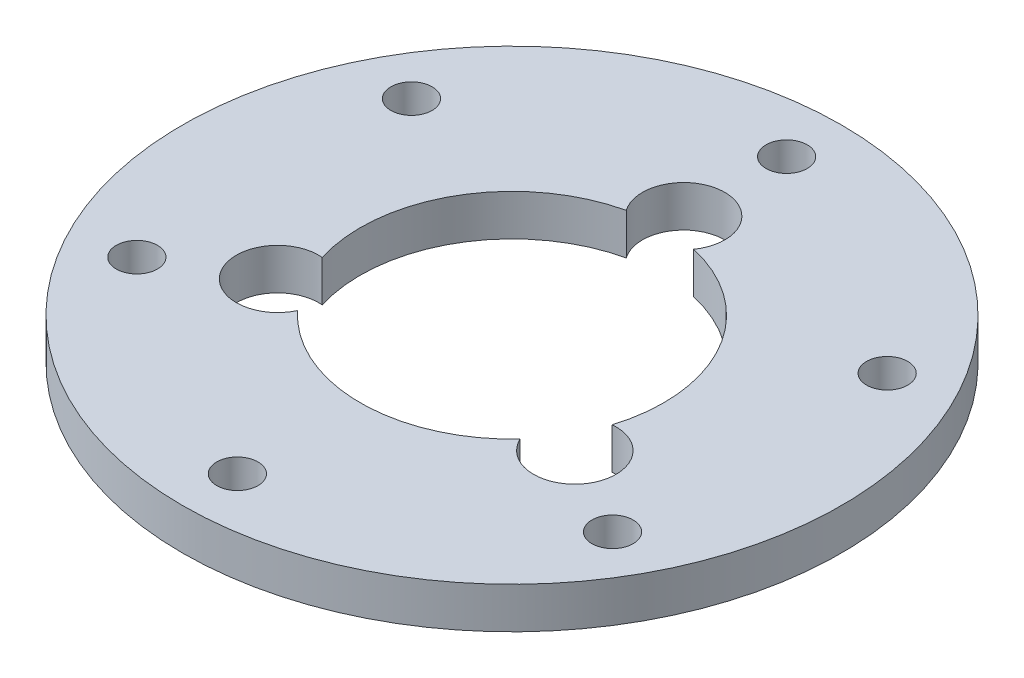
ISO-10303-21;
HEADER;
FILE_DESCRIPTION(('STEP AP214'),'2;1');
FILE_NAME('part.step','',(''),(''),'','','');
FILE_SCHEMA(('AUTOMOTIVE_DESIGN { 1 0 10303 214 1 1 1 1 }'));
ENDSEC;
DATA;
#1=APPLICATION_CONTEXT('core data for automotive mechanical design processes');
#2=APPLICATION_PROTOCOL_DEFINITION('international standard','automotive_design',2000,#1);
#3=PRODUCT_CONTEXT('',#1,'mechanical');
#4=PRODUCT('Part','Part','',(#3));
#5=PRODUCT_RELATED_PRODUCT_CATEGORY('part','',(#4));
#6=PRODUCT_DEFINITION_FORMATION('','',#4);
#7=PRODUCT_DEFINITION_CONTEXT('part definition',#1,'design');
#8=PRODUCT_DEFINITION('design','',#6,#7);
#9=PRODUCT_DEFINITION_SHAPE('','',#8);
#10=(LENGTH_UNIT() NAMED_UNIT(*) SI_UNIT(.MILLI.,.METRE.));
#11=(NAMED_UNIT(*) PLANE_ANGLE_UNIT() SI_UNIT($,.RADIAN.));
#12=(NAMED_UNIT(*) SI_UNIT($,.STERADIAN.) SOLID_ANGLE_UNIT());
#13=UNCERTAINTY_MEASURE_WITH_UNIT(LENGTH_MEASURE(1.E-05),#10,'distance_accuracy_value','');
#14=(GEOMETRIC_REPRESENTATION_CONTEXT(3) GLOBAL_UNCERTAINTY_ASSIGNED_CONTEXT((#13)) GLOBAL_UNIT_ASSIGNED_CONTEXT((#10,
#11,#12)) REPRESENTATION_CONTEXT('',''));
#15=CARTESIAN_POINT('',(0.,0.,0.));
#16=DIRECTION('',(0.,0.,1.));
#17=DIRECTION('',(1.,0.,0.));
#18=AXIS2_PLACEMENT_3D('',#15,#16,#17);
#19=CARTESIAN_POINT('',(0.,3.,0.));
#20=DIRECTION('',(0.,-1.,0.));
#21=DIRECTION('',(0.,0.,-1.));
#22=AXIS2_PLACEMENT_3D('',#19,#20,#21);
#23=CYLINDRICAL_SURFACE('',#22,11.05);
#24=DIRECTION('',(0.,-1.,0.));
#25=VECTOR('',#24,1.);
#26=CARTESIAN_POINT('',(8.10373057428424,5.,7.51212691449039));
#27=LINE('',#26,#25);
#28=CARTESIAN_POINT('',(8.10373057428424,0.,7.51212691449039));
#29=VERTEX_POINT('',#28);
#30=CARTESIAN_POINT('',(8.10373057428424,3.,7.51212691449039));
#31=VERTEX_POINT('',#30);
#32=EDGE_CURVE('E11',#29,#31,#27,.F.);
#33=ORIENTED_EDGE('',*,*,#32,.F.);
#34=CARTESIAN_POINT('',(0.,0.,0.));
#35=DIRECTION('',(0.,1.,0.));
#36=DIRECTION('',(0.,0.,1.));
#37=AXIS2_PLACEMENT_3D('',#34,#35,#36);
#38=CIRCLE('',#37,11.05);
#39=CARTESIAN_POINT('',(-8.10373057428423,0.,7.5121269144904));
#40=VERTEX_POINT('',#39);
#41=EDGE_CURVE('E111',#40,#29,#38,.T.);
#42=ORIENTED_EDGE('',*,*,#41,.F.);
#43=DIRECTION('',(0.,-1.,0.));
#44=VECTOR('',#43,1.);
#45=CARTESIAN_POINT('',(-8.10373057428423,5.,7.51212691449039));
#46=LINE('',#45,#44);
#47=CARTESIAN_POINT('',(-8.10373057428423,3.,7.5121269144904));
#48=VERTEX_POINT('',#47);
#49=EDGE_CURVE('E90',#48,#40,#46,.T.);
#50=ORIENTED_EDGE('',*,*,#49,.F.);
#51=CARTESIAN_POINT('',(0.,3.,0.));
#52=DIRECTION('',(0.,1.,0.));
#53=DIRECTION('',(0.,0.,1.));
#54=AXIS2_PLACEMENT_3D('',#51,#52,#53);
#55=CIRCLE('',#54,11.05);
#56=EDGE_CURVE('E113',#48,#31,#55,.T.);
#57=ORIENTED_EDGE('',*,*,#56,.T.);
#58=EDGE_LOOP('',(#33,#42,#50,#57));
#59=FACE_BOUND('',#58,.T.);
#60=ADVANCED_FACE('F36',(#59),#23,.F.);
#61=DIRECTION('',(0.,-1.,0.));
#62=VECTOR('',#61,1.);
#63=CARTESIAN_POINT('',(-10.5575580315436,5.,3.26197308550961));
#64=LINE('',#63,#62);
#65=CARTESIAN_POINT('',(-10.5575580315436,0.,3.26197308550961));
#66=VERTEX_POINT('',#65);
#67=CARTESIAN_POINT('',(-10.5575580315436,3.,3.26197308550962));
#68=VERTEX_POINT('',#67);
#69=EDGE_CURVE('E89',#66,#68,#64,.F.);
#70=ORIENTED_EDGE('',*,*,#69,.F.);
#71=CARTESIAN_POINT('',(-2.45382745725937,0.,-10.7741));
#72=VERTEX_POINT('',#71);
#73=EDGE_CURVE('E102',#72,#66,#38,.T.);
#74=ORIENTED_EDGE('',*,*,#73,.F.);
#75=DIRECTION('',(0.,-1.,0.));
#76=VECTOR('',#75,1.);
#77=CARTESIAN_POINT('',(-2.45382745725937,5.,-10.7741));
#78=LINE('',#77,#76);
#79=CARTESIAN_POINT('',(-2.45382745725938,3.,-10.7741));
#80=VERTEX_POINT('',#79);
#81=EDGE_CURVE('E121',#80,#72,#78,.T.);
#82=ORIENTED_EDGE('',*,*,#81,.F.);
#83=EDGE_CURVE('E104',#80,#68,#55,.T.);
#84=ORIENTED_EDGE('',*,*,#83,.T.);
#85=EDGE_LOOP('',(#70,#74,#82,#84));
#86=FACE_BOUND('',#85,.T.);
#87=ADVANCED_FACE('F101',(#86),#23,.F.);
#88=CARTESIAN_POINT('',(0.,3.,0.));
#89=DIRECTION('',(0.,1.,0.));
#90=DIRECTION('',(0.,0.,1.));
#91=AXIS2_PLACEMENT_3D('',#88,#89,#90);
#92=PLANE('',#91);
#93=CARTESIAN_POINT('',(10.8253175473055,3.,6.25));
#94=DIRECTION('',(0.,1.,0.));
#95=DIRECTION('',(0.,0.,1.));
#96=AXIS2_PLACEMENT_3D('',#93,#94,#95);
#97=CIRCLE('',#96,3.);
#98=CARTESIAN_POINT('',(10.5575580315436,3.,3.26197308550961));
#99=VERTEX_POINT('',#98);
#100=EDGE_CURVE('E135',#31,#99,#97,.T.);
#101=ORIENTED_EDGE('',*,*,#100,.F.);
#102=ORIENTED_EDGE('',*,*,#56,.F.);
#103=CARTESIAN_POINT('',(-10.8253175473055,3.,6.25000000000001));
#104=DIRECTION('',(0.,1.,0.));
#105=DIRECTION('',(0.,0.,1.));
#106=AXIS2_PLACEMENT_3D('',#103,#104,#105);
#107=CIRCLE('',#106,3.);
#108=EDGE_CURVE('E51',#68,#48,#107,.T.);
#109=ORIENTED_EDGE('',*,*,#108,.F.);
#110=ORIENTED_EDGE('',*,*,#83,.F.);
#111=CARTESIAN_POINT('',(0.,3.,-12.5));
#112=DIRECTION('',(0.,1.,0.));
#113=DIRECTION('',(0.,0.,1.));
#114=AXIS2_PLACEMENT_3D('',#111,#112,#113);
#115=CIRCLE('',#114,3.);
#116=CARTESIAN_POINT('',(2.45382745725937,3.,-10.7741));
#117=VERTEX_POINT('',#116);
#118=EDGE_CURVE('E59',#117,#80,#115,.T.);
#119=ORIENTED_EDGE('',*,*,#118,.F.);
#120=EDGE_CURVE('E125',#99,#117,#55,.T.);
#121=ORIENTED_EDGE('',*,*,#120,.F.);
#122=EDGE_LOOP('',(#101,#102,#109,#110,#119,#121));
#123=FACE_BOUND('',#122,.T.);
#124=CARTESIAN_POINT('',(-17.3205080756888,3.,10.));
#125=DIRECTION('',(0.,1.,0.));
#126=DIRECTION('',(0.,0.,1.));
#127=AXIS2_PLACEMENT_3D('',#124,#125,#126);
#128=CIRCLE('',#127,1.5);
#129=CARTESIAN_POINT('',(-17.3205080756888,3.,11.5));
#130=VERTEX_POINT('',#129);
#131=EDGE_CURVE('E159',#130,#130,#128,.T.);
#132=ORIENTED_EDGE('',*,*,#131,.F.);
#133=EDGE_LOOP('',(#132));
#134=FACE_BOUND('',#133,.T.);
#135=CARTESIAN_POINT('',(17.3205080756888,3.,10.));
#136=DIRECTION('',(0.,1.,0.));
#137=DIRECTION('',(0.,0.,1.));
#138=AXIS2_PLACEMENT_3D('',#135,#136,#137);
#139=CIRCLE('',#138,1.5);
#140=CARTESIAN_POINT('',(17.3205080756888,3.,11.5));
#141=VERTEX_POINT('',#140);
#142=EDGE_CURVE('E171',#141,#141,#139,.T.);
#143=ORIENTED_EDGE('',*,*,#142,.F.);
#144=EDGE_LOOP('',(#143));
#145=FACE_BOUND('',#144,.T.);
#146=CARTESIAN_POINT('',(0.,3.,0.));
#147=DIRECTION('',(0.,1.,0.));
#148=DIRECTION('',(0.,0.,1.));
#149=AXIS2_PLACEMENT_3D('',#146,#147,#148);
#150=CIRCLE('',#149,24.);
#151=CARTESIAN_POINT('',(0.,3.,24.));
#152=VERTEX_POINT('',#151);
#153=EDGE_CURVE('E118',#152,#152,#150,.T.);
#154=ORIENTED_EDGE('',*,*,#153,.T.);
#155=EDGE_LOOP('',(#154));
#156=FACE_BOUND('',#155,.T.);
#157=CARTESIAN_POINT('',(0.,3.,-20.));
#158=DIRECTION('',(0.,1.,0.));
#159=DIRECTION('',(0.,0.,1.));
#160=AXIS2_PLACEMENT_3D('',#157,#158,#159);
#161=CIRCLE('',#160,1.5);
#162=CARTESIAN_POINT('',(0.,3.,-18.5));
#163=VERTEX_POINT('',#162);
#164=EDGE_CURVE('E114',#163,#163,#161,.T.);
#165=ORIENTED_EDGE('',*,*,#164,.F.);
#166=EDGE_LOOP('',(#165));
#167=FACE_BOUND('',#166,.T.);
#168=CARTESIAN_POINT('',(17.3205080756888,3.,-10.));
#169=DIRECTION('',(0.,1.,0.));
#170=DIRECTION('',(0.,0.,1.));
#171=AXIS2_PLACEMENT_3D('',#168,#169,#170);
#172=CIRCLE('',#171,1.5);
#173=CARTESIAN_POINT('',(17.3205080756888,3.,-8.5));
#174=VERTEX_POINT('',#173);
#175=EDGE_CURVE('E177',#174,#174,#172,.T.);
#176=ORIENTED_EDGE('',*,*,#175,.F.);
#177=EDGE_LOOP('',(#176));
#178=FACE_BOUND('',#177,.T.);
#179=CARTESIAN_POINT('',(0.,3.,20.));
#180=DIRECTION('',(0.,1.,0.));
#181=DIRECTION('',(0.,0.,1.));
#182=AXIS2_PLACEMENT_3D('',#179,#180,#181);
#183=CIRCLE('',#182,1.5);
#184=CARTESIAN_POINT('',(0.,3.,21.5));
#185=VERTEX_POINT('',#184);
#186=EDGE_CURVE('E165',#185,#185,#183,.T.);
#187=ORIENTED_EDGE('',*,*,#186,.F.);
#188=EDGE_LOOP('',(#187));
#189=FACE_BOUND('',#188,.T.);
#190=CARTESIAN_POINT('',(-17.3205080756888,3.,-9.99999999999999));
#191=DIRECTION('',(0.,1.,0.));
#192=DIRECTION('',(0.,0.,1.));
#193=AXIS2_PLACEMENT_3D('',#190,#191,#192);
#194=CIRCLE('',#193,1.5);
#195=CARTESIAN_POINT('',(-17.3205080756888,3.,-8.49999999999999));
#196=VERTEX_POINT('',#195);
#197=EDGE_CURVE('E153',#196,#196,#194,.T.);
#198=ORIENTED_EDGE('',*,*,#197,.F.);
#199=EDGE_LOOP('',(#198));
#200=FACE_BOUND('',#199,.T.);
#201=ADVANCED_FACE('F145',(#123,#134,#145,#156,#167,#178,#189,#200),#92,.T.);
#202=CARTESIAN_POINT('',(0.,0.,0.));
#203=DIRECTION('',(0.,1.,0.));
#204=DIRECTION('',(0.,0.,1.));
#205=AXIS2_PLACEMENT_3D('',#202,#203,#204);
#206=PLANE('',#205);
#207=CARTESIAN_POINT('',(0.,0.,0.));
#208=DIRECTION('',(0.,1.,0.));
#209=DIRECTION('',(0.,0.,1.));
#210=AXIS2_PLACEMENT_3D('',#207,#208,#209);
#211=CIRCLE('',#210,24.);
#212=CARTESIAN_POINT('',(0.,0.,24.));
#213=VERTEX_POINT('',#212);
#214=EDGE_CURVE('E122',#213,#213,#211,.T.);
#215=ORIENTED_EDGE('',*,*,#214,.F.);
#216=EDGE_LOOP('',(#215));
#217=FACE_BOUND('',#216,.T.);
#218=ORIENTED_EDGE('',*,*,#41,.T.);
#219=CARTESIAN_POINT('',(10.8253175473055,0.,6.25));
#220=DIRECTION('',(0.,-1.,0.));
#221=DIRECTION('',(0.,0.,-1.));
#222=AXIS2_PLACEMENT_3D('',#219,#220,#221);
#223=CIRCLE('',#222,3.);
#224=CARTESIAN_POINT('',(10.5575580315436,0.,3.26197308550961));
#225=VERTEX_POINT('',#224);
#226=EDGE_CURVE('E95',#225,#29,#223,.T.);
#227=ORIENTED_EDGE('',*,*,#226,.F.);
#228=CARTESIAN_POINT('',(2.45382745725937,0.,-10.7741));
#229=VERTEX_POINT('',#228);
#230=EDGE_CURVE('E110',#225,#229,#38,.T.);
#231=ORIENTED_EDGE('',*,*,#230,.T.);
#232=CARTESIAN_POINT('',(0.,0.,-12.5));
#233=DIRECTION('',(0.,-1.,0.));
#234=DIRECTION('',(0.,0.,-1.));
#235=AXIS2_PLACEMENT_3D('',#232,#233,#234);
#236=CIRCLE('',#235,3.);
#237=EDGE_CURVE('E96',#72,#229,#236,.T.);
#238=ORIENTED_EDGE('',*,*,#237,.F.);
#239=ORIENTED_EDGE('',*,*,#73,.T.);
#240=CARTESIAN_POINT('',(-10.8253175473055,0.,6.25000000000001));
#241=DIRECTION('',(0.,-1.,0.));
#242=DIRECTION('',(0.,0.,-1.));
#243=AXIS2_PLACEMENT_3D('',#240,#241,#242);
#244=CIRCLE('',#243,3.);
#245=EDGE_CURVE('E86',#40,#66,#244,.T.);
#246=ORIENTED_EDGE('',*,*,#245,.F.);
#247=EDGE_LOOP('',(#218,#227,#231,#238,#239,#246));
#248=FACE_BOUND('',#247,.T.);
#249=CARTESIAN_POINT('',(0.,0.,-20.));
#250=DIRECTION('',(0.,1.,0.));
#251=DIRECTION('',(0.,0.,1.));
#252=AXIS2_PLACEMENT_3D('',#249,#250,#251);
#253=CIRCLE('',#252,1.5);
#254=CARTESIAN_POINT('',(0.,0.,-18.5));
#255=VERTEX_POINT('',#254);
#256=EDGE_CURVE('E180',#255,#255,#253,.T.);
#257=ORIENTED_EDGE('',*,*,#256,.T.);
#258=EDGE_LOOP('',(#257));
#259=FACE_BOUND('',#258,.T.);
#260=CARTESIAN_POINT('',(17.3205080756888,0.,-10.));
#261=DIRECTION('',(0.,1.,0.));
#262=DIRECTION('',(0.,0.,1.));
#263=AXIS2_PLACEMENT_3D('',#260,#261,#262);
#264=CIRCLE('',#263,1.5);
#265=CARTESIAN_POINT('',(17.3205080756888,0.,-8.5));
#266=VERTEX_POINT('',#265);
#267=EDGE_CURVE('E174',#266,#266,#264,.T.);
#268=ORIENTED_EDGE('',*,*,#267,.T.);
#269=EDGE_LOOP('',(#268));
#270=FACE_BOUND('',#269,.T.);
#271=CARTESIAN_POINT('',(17.3205080756888,0.,10.));
#272=DIRECTION('',(0.,1.,0.));
#273=DIRECTION('',(0.,0.,1.));
#274=AXIS2_PLACEMENT_3D('',#271,#272,#273);
#275=CIRCLE('',#274,1.5);
#276=CARTESIAN_POINT('',(17.3205080756888,0.,11.5));
#277=VERTEX_POINT('',#276);
#278=EDGE_CURVE('E168',#277,#277,#275,.T.);
#279=ORIENTED_EDGE('',*,*,#278,.T.);
#280=EDGE_LOOP('',(#279));
#281=FACE_BOUND('',#280,.T.);
#282=CARTESIAN_POINT('',(0.,0.,20.));
#283=DIRECTION('',(0.,1.,0.));
#284=DIRECTION('',(0.,0.,1.));
#285=AXIS2_PLACEMENT_3D('',#282,#283,#284);
#286=CIRCLE('',#285,1.5);
#287=CARTESIAN_POINT('',(0.,0.,21.5));
#288=VERTEX_POINT('',#287);
#289=EDGE_CURVE('E162',#288,#288,#286,.T.);
#290=ORIENTED_EDGE('',*,*,#289,.T.);
#291=EDGE_LOOP('',(#290));
#292=FACE_BOUND('',#291,.T.);
#293=CARTESIAN_POINT('',(-17.3205080756888,0.,10.));
#294=DIRECTION('',(0.,1.,0.));
#295=DIRECTION('',(0.,0.,1.));
#296=AXIS2_PLACEMENT_3D('',#293,#294,#295);
#297=CIRCLE('',#296,1.5);
#298=CARTESIAN_POINT('',(-17.3205080756888,0.,11.5));
#299=VERTEX_POINT('',#298);
#300=EDGE_CURVE('E156',#299,#299,#297,.T.);
#301=ORIENTED_EDGE('',*,*,#300,.T.);
#302=EDGE_LOOP('',(#301));
#303=FACE_BOUND('',#302,.T.);
#304=CARTESIAN_POINT('',(-17.3205080756888,0.,-9.99999999999999));
#305=DIRECTION('',(0.,1.,0.));
#306=DIRECTION('',(0.,0.,1.));
#307=AXIS2_PLACEMENT_3D('',#304,#305,#306);
#308=CIRCLE('',#307,1.5);
#309=CARTESIAN_POINT('',(-17.3205080756888,0.,-8.49999999999999));
#310=VERTEX_POINT('',#309);
#311=EDGE_CURVE('E152',#310,#310,#308,.T.);
#312=ORIENTED_EDGE('',*,*,#311,.T.);
#313=EDGE_LOOP('',(#312));
#314=FACE_BOUND('',#313,.T.);
#315=ADVANCED_FACE('F107',(#217,#248,#259,#270,#281,#292,#303,#314),#206,.F.);
#316=CARTESIAN_POINT('',(0.,3.,0.));
#317=DIRECTION('',(0.,-1.,0.));
#318=DIRECTION('',(0.,0.,-1.));
#319=AXIS2_PLACEMENT_3D('',#316,#317,#318);
#320=CYLINDRICAL_SURFACE('',#319,24.);
#321=ORIENTED_EDGE('',*,*,#153,.F.);
#322=EDGE_LOOP('',(#321));
#323=FACE_BOUND('',#322,.T.);
#324=ORIENTED_EDGE('',*,*,#214,.T.);
#325=EDGE_LOOP('',(#324));
#326=FACE_BOUND('',#325,.T.);
#327=ADVANCED_FACE('F38',(#323,#326),#320,.T.);
#328=DIRECTION('',(0.,-1.,0.));
#329=VECTOR('',#328,1.);
#330=CARTESIAN_POINT('',(10.5575580315436,5.,3.26197308550961));
#331=LINE('',#330,#329);
#332=EDGE_CURVE('E44',#99,#225,#331,.T.);
#333=ORIENTED_EDGE('',*,*,#332,.F.);
#334=ORIENTED_EDGE('',*,*,#120,.T.);
#335=DIRECTION('',(0.,-1.,0.));
#336=VECTOR('',#335,1.);
#337=CARTESIAN_POINT('',(2.45382745725937,5.,-10.7741));
#338=LINE('',#337,#336);
#339=EDGE_CURVE('E127',#229,#117,#338,.F.);
#340=ORIENTED_EDGE('',*,*,#339,.F.);
#341=ORIENTED_EDGE('',*,*,#230,.F.);
#342=EDGE_LOOP('',(#333,#334,#340,#341));
#343=FACE_BOUND('',#342,.T.);
#344=ADVANCED_FACE('F142',(#343),#23,.F.);
#345=CARTESIAN_POINT('',(0.,3.,-20.));
#346=DIRECTION('',(0.,-1.,0.));
#347=DIRECTION('',(0.,0.,-1.));
#348=AXIS2_PLACEMENT_3D('',#345,#346,#347);
#349=CYLINDRICAL_SURFACE('',#348,1.5);
#350=ORIENTED_EDGE('',*,*,#164,.T.);
#351=EDGE_LOOP('',(#350));
#352=FACE_BOUND('',#351,.T.);
#353=ORIENTED_EDGE('',*,*,#256,.F.);
#354=EDGE_LOOP('',(#353));
#355=FACE_BOUND('',#354,.T.);
#356=ADVANCED_FACE('F188',(#352,#355),#349,.F.);
#357=CARTESIAN_POINT('',(17.3205080756888,3.,-10.));
#358=DIRECTION('',(0.,-1.,0.));
#359=DIRECTION('',(0.,0.,-1.));
#360=AXIS2_PLACEMENT_3D('',#357,#358,#359);
#361=CYLINDRICAL_SURFACE('',#360,1.5);
#362=ORIENTED_EDGE('',*,*,#175,.T.);
#363=EDGE_LOOP('',(#362));
#364=FACE_BOUND('',#363,.T.);
#365=ORIENTED_EDGE('',*,*,#267,.F.);
#366=EDGE_LOOP('',(#365));
#367=FACE_BOUND('',#366,.T.);
#368=ADVANCED_FACE('F190',(#364,#367),#361,.F.);
#369=CARTESIAN_POINT('',(17.3205080756888,3.,10.));
#370=DIRECTION('',(0.,-1.,0.));
#371=DIRECTION('',(0.,0.,-1.));
#372=AXIS2_PLACEMENT_3D('',#369,#370,#371);
#373=CYLINDRICAL_SURFACE('',#372,1.5);
#374=ORIENTED_EDGE('',*,*,#142,.T.);
#375=EDGE_LOOP('',(#374));
#376=FACE_BOUND('',#375,.T.);
#377=ORIENTED_EDGE('',*,*,#278,.F.);
#378=EDGE_LOOP('',(#377));
#379=FACE_BOUND('',#378,.T.);
#380=ADVANCED_FACE('F197',(#376,#379),#373,.F.);
#381=CARTESIAN_POINT('',(0.,3.,20.));
#382=DIRECTION('',(0.,-1.,0.));
#383=DIRECTION('',(0.,0.,-1.));
#384=AXIS2_PLACEMENT_3D('',#381,#382,#383);
#385=CYLINDRICAL_SURFACE('',#384,1.5);
#386=ORIENTED_EDGE('',*,*,#186,.T.);
#387=EDGE_LOOP('',(#386));
#388=FACE_BOUND('',#387,.T.);
#389=ORIENTED_EDGE('',*,*,#289,.F.);
#390=EDGE_LOOP('',(#389));
#391=FACE_BOUND('',#390,.T.);
#392=ADVANCED_FACE('F241',(#388,#391),#385,.F.);
#393=CARTESIAN_POINT('',(-17.3205080756888,3.,10.));
#394=DIRECTION('',(0.,-1.,0.));
#395=DIRECTION('',(0.,0.,-1.));
#396=AXIS2_PLACEMENT_3D('',#393,#394,#395);
#397=CYLINDRICAL_SURFACE('',#396,1.5);
#398=ORIENTED_EDGE('',*,*,#131,.T.);
#399=EDGE_LOOP('',(#398));
#400=FACE_BOUND('',#399,.T.);
#401=ORIENTED_EDGE('',*,*,#300,.F.);
#402=EDGE_LOOP('',(#401));
#403=FACE_BOUND('',#402,.T.);
#404=ADVANCED_FACE('F232',(#400,#403),#397,.F.);
#405=CARTESIAN_POINT('',(-17.3205080756888,3.,-9.99999999999999));
#406=DIRECTION('',(0.,-1.,0.));
#407=DIRECTION('',(0.,0.,-1.));
#408=AXIS2_PLACEMENT_3D('',#405,#406,#407);
#409=CYLINDRICAL_SURFACE('',#408,1.5);
#410=ORIENTED_EDGE('',*,*,#197,.T.);
#411=EDGE_LOOP('',(#410));
#412=FACE_BOUND('',#411,.T.);
#413=ORIENTED_EDGE('',*,*,#311,.F.);
#414=EDGE_LOOP('',(#413));
#415=FACE_BOUND('',#414,.T.);
#416=ADVANCED_FACE('F229',(#412,#415),#409,.F.);
#417=CARTESIAN_POINT('',(0.,10.,-12.5));
#418=DIRECTION('',(0.,-1.,0.));
#419=DIRECTION('',(0.,0.,-1.));
#420=AXIS2_PLACEMENT_3D('',#417,#418,#419);
#421=CYLINDRICAL_SURFACE('',#420,3.);
#422=ORIENTED_EDGE('',*,*,#339,.T.);
#423=ORIENTED_EDGE('',*,*,#118,.T.);
#424=ORIENTED_EDGE('',*,*,#81,.T.);
#425=ORIENTED_EDGE('',*,*,#237,.T.);
#426=EDGE_LOOP('',(#422,#423,#424,#425));
#427=FACE_BOUND('',#426,.T.);
#428=ADVANCED_FACE('F143',(#427),#421,.F.);
#429=CARTESIAN_POINT('',(-10.8253175473055,10.,6.25000000000001));
#430=DIRECTION('',(0.,-1.,0.));
#431=DIRECTION('',(0.,0.,-1.));
#432=AXIS2_PLACEMENT_3D('',#429,#430,#431);
#433=CYLINDRICAL_SURFACE('',#432,3.);
#434=ORIENTED_EDGE('',*,*,#69,.T.);
#435=ORIENTED_EDGE('',*,*,#108,.T.);
#436=ORIENTED_EDGE('',*,*,#49,.T.);
#437=ORIENTED_EDGE('',*,*,#245,.T.);
#438=EDGE_LOOP('',(#434,#435,#436,#437));
#439=FACE_BOUND('',#438,.T.);
#440=ADVANCED_FACE('F88',(#439),#433,.F.);
#441=CARTESIAN_POINT('',(10.8253175473055,10.,6.25));
#442=DIRECTION('',(0.,-1.,0.));
#443=DIRECTION('',(0.,0.,-1.));
#444=AXIS2_PLACEMENT_3D('',#441,#442,#443);
#445=CYLINDRICAL_SURFACE('',#444,3.);
#446=ORIENTED_EDGE('',*,*,#32,.T.);
#447=ORIENTED_EDGE('',*,*,#100,.T.);
#448=ORIENTED_EDGE('',*,*,#332,.T.);
#449=ORIENTED_EDGE('',*,*,#226,.T.);
#450=EDGE_LOOP('',(#446,#447,#448,#449));
#451=FACE_BOUND('',#450,.T.);
#452=ADVANCED_FACE('F132',(#451),#445,.F.);
#453=CLOSED_SHELL('',(#60,#87,#201,#315,#327,#344,#356,#368,#380,#392,#404,#416,#428,#440,#452));
#454=MANIFOLD_SOLID_BREP('B2',#453);
#455=ADVANCED_BREP_SHAPE_REPRESENTATION('',(#18,#454),#14);
#456=SHAPE_DEFINITION_REPRESENTATION(#9,#455);
ENDSEC;
END-ISO-10303-21;
